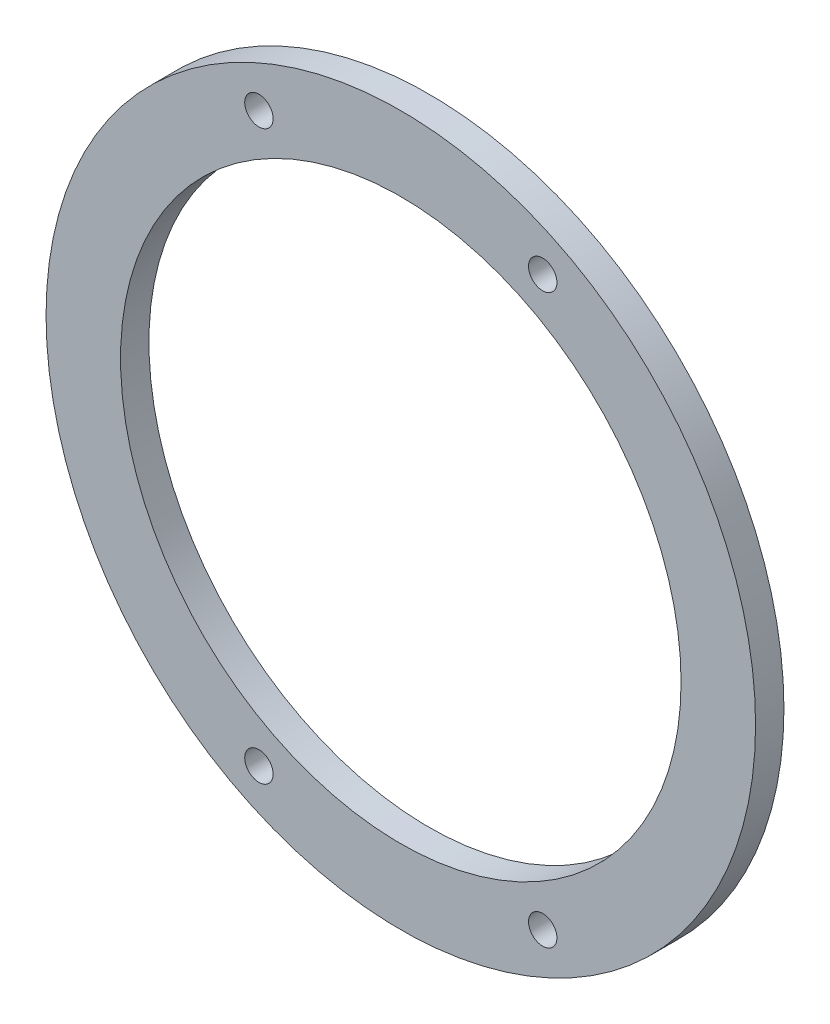
ISO-10303-21;
HEADER;
FILE_DESCRIPTION(('STEP AP214'),'2;1');
FILE_NAME('part.step','',(''),(''),'','','');
FILE_SCHEMA(('AUTOMOTIVE_DESIGN { 1 0 10303 214 1 1 1 1 }'));
ENDSEC;
DATA;
#1=APPLICATION_CONTEXT('core data for automotive mechanical design processes');
#2=APPLICATION_PROTOCOL_DEFINITION('international standard','automotive_design',2000,#1);
#3=PRODUCT_CONTEXT('',#1,'mechanical');
#4=PRODUCT('Part','Part','',(#3));
#5=PRODUCT_RELATED_PRODUCT_CATEGORY('part','',(#4));
#6=PRODUCT_DEFINITION_FORMATION('','',#4);
#7=PRODUCT_DEFINITION_CONTEXT('part definition',#1,'design');
#8=PRODUCT_DEFINITION('design','',#6,#7);
#9=PRODUCT_DEFINITION_SHAPE('','',#8);
#10=(LENGTH_UNIT() NAMED_UNIT(*) SI_UNIT(.MILLI.,.METRE.));
#11=(NAMED_UNIT(*) PLANE_ANGLE_UNIT() SI_UNIT($,.RADIAN.));
#12=(NAMED_UNIT(*) SI_UNIT($,.STERADIAN.) SOLID_ANGLE_UNIT());
#13=UNCERTAINTY_MEASURE_WITH_UNIT(LENGTH_MEASURE(1.E-05),#10,'distance_accuracy_value','');
#14=(GEOMETRIC_REPRESENTATION_CONTEXT(3) GLOBAL_UNCERTAINTY_ASSIGNED_CONTEXT((#13)) GLOBAL_UNIT_ASSIGNED_CONTEXT((#10,
#11,#12)) REPRESENTATION_CONTEXT('',''));
#15=CARTESIAN_POINT('',(0.,0.,0.));
#16=DIRECTION('',(0.,0.,1.));
#17=DIRECTION('',(1.,0.,0.));
#18=AXIS2_PLACEMENT_3D('',#15,#16,#17);
#19=CARTESIAN_POINT('',(0.,-21.8542857142857,4.));
#20=DIRECTION('',(0.,0.,1.));
#21=DIRECTION('',(1.,0.,0.));
#22=AXIS2_PLACEMENT_3D('',#19,#20,#21);
#23=PLANE('',#22);
#24=CARTESIAN_POINT('',(-19.9999999999999,-61.8542857142858,4.));
#25=DIRECTION('',(0.,0.,1.));
#26=DIRECTION('',(-1.,0.,0.));
#27=AXIS2_PLACEMENT_3D('',#24,#25,#26);
#28=CIRCLE('',#27,1.99999999999998);
#29=CARTESIAN_POINT('',(-21.9999999999999,-61.8542857142858,4.));
#30=VERTEX_POINT('',#29);
#31=EDGE_CURVE('E72',#30,#30,#28,.T.);
#32=ORIENTED_EDGE('',*,*,#31,.F.);
#33=EDGE_LOOP('',(#32));
#34=FACE_BOUND('',#33,.T.);
#35=CARTESIAN_POINT('',(20.,18.1457142857143,4.));
#36=DIRECTION('',(0.,0.,1.));
#37=DIRECTION('',(1.,0.,0.));
#38=AXIS2_PLACEMENT_3D('',#35,#36,#37);
#39=CIRCLE('',#38,2.);
#40=CARTESIAN_POINT('',(22.,18.1457142857143,4.));
#41=VERTEX_POINT('',#40);
#42=EDGE_CURVE('E56',#41,#41,#39,.T.);
#43=ORIENTED_EDGE('',*,*,#42,.F.);
#44=EDGE_LOOP('',(#43));
#45=FACE_BOUND('',#44,.T.);
#46=CARTESIAN_POINT('',(0.,-21.8542857142857,4.));
#47=DIRECTION('',(0.,0.,1.));
#48=DIRECTION('',(1.,0.,0.));
#49=AXIS2_PLACEMENT_3D('',#46,#47,#48);
#50=CIRCLE('',#49,50.);
#51=CARTESIAN_POINT('',(50.,-21.8542857142857,4.));
#52=VERTEX_POINT('',#51);
#53=EDGE_CURVE('E10',#52,#52,#50,.T.);
#54=ORIENTED_EDGE('',*,*,#53,.T.);
#55=EDGE_LOOP('',(#54));
#56=FACE_BOUND('',#55,.T.);
#57=CARTESIAN_POINT('',(-19.9999999999999,18.1457142857144,4.));
#58=DIRECTION('',(0.,0.,1.));
#59=DIRECTION('',(1.,0.,0.));
#60=AXIS2_PLACEMENT_3D('',#57,#58,#59);
#61=CIRCLE('',#60,1.99999999999998);
#62=CARTESIAN_POINT('',(-17.9999999999999,18.1457142857144,4.));
#63=VERTEX_POINT('',#62);
#64=EDGE_CURVE('E50',#63,#63,#61,.T.);
#65=ORIENTED_EDGE('',*,*,#64,.F.);
#66=EDGE_LOOP('',(#65));
#67=FACE_BOUND('',#66,.T.);
#68=CARTESIAN_POINT('',(20.,-61.8542857142857,4.));
#69=DIRECTION('',(0.,0.,1.));
#70=DIRECTION('',(-1.,0.,0.));
#71=AXIS2_PLACEMENT_3D('',#68,#69,#70);
#72=CIRCLE('',#71,2.);
#73=CARTESIAN_POINT('',(18.,-61.8542857142857,4.));
#74=VERTEX_POINT('',#73);
#75=EDGE_CURVE('E64',#74,#74,#72,.T.);
#76=ORIENTED_EDGE('',*,*,#75,.F.);
#77=EDGE_LOOP('',(#76));
#78=FACE_BOUND('',#77,.T.);
#79=CARTESIAN_POINT('',(0.,-21.8542857142857,4.));
#80=DIRECTION('',(0.,0.,1.));
#81=DIRECTION('',(1.,0.,0.));
#82=AXIS2_PLACEMENT_3D('',#79,#80,#81);
#83=CIRCLE('',#82,39.5);
#84=CARTESIAN_POINT('',(39.5,-21.8542857142857,4.));
#85=VERTEX_POINT('',#84);
#86=EDGE_CURVE('E80',#85,#85,#83,.T.);
#87=ORIENTED_EDGE('',*,*,#86,.F.);
#88=EDGE_LOOP('',(#87));
#89=FACE_BOUND('',#88,.T.);
#90=ADVANCED_FACE('F37',(#34,#45,#56,#67,#78,#89),#23,.T.);
#91=CARTESIAN_POINT('',(0.,-21.8542857142857,0.));
#92=DIRECTION('',(0.,0.,1.));
#93=DIRECTION('',(1.,0.,0.));
#94=AXIS2_PLACEMENT_3D('',#91,#92,#93);
#95=PLANE('',#94);
#96=CARTESIAN_POINT('',(0.,-21.8542857142857,0.));
#97=DIRECTION('',(0.,0.,1.));
#98=DIRECTION('',(1.,0.,0.));
#99=AXIS2_PLACEMENT_3D('',#96,#97,#98);
#100=CIRCLE('',#99,50.);
#101=CARTESIAN_POINT('',(50.,-21.8542857142857,0.));
#102=VERTEX_POINT('',#101);
#103=EDGE_CURVE('E41',#102,#102,#100,.T.);
#104=ORIENTED_EDGE('',*,*,#103,.F.);
#105=EDGE_LOOP('',(#104));
#106=FACE_BOUND('',#105,.T.);
#107=CARTESIAN_POINT('',(-19.9999999999999,18.1457142857144,0.));
#108=DIRECTION('',(0.,0.,1.));
#109=DIRECTION('',(1.,0.,0.));
#110=AXIS2_PLACEMENT_3D('',#107,#108,#109);
#111=CIRCLE('',#110,1.99999999999998);
#112=CARTESIAN_POINT('',(-17.9999999999999,18.1457142857144,0.));
#113=VERTEX_POINT('',#112);
#114=EDGE_CURVE('E52',#113,#113,#111,.T.);
#115=ORIENTED_EDGE('',*,*,#114,.T.);
#116=EDGE_LOOP('',(#115));
#117=FACE_BOUND('',#116,.T.);
#118=CARTESIAN_POINT('',(20.,18.1457142857143,0.));
#119=DIRECTION('',(0.,0.,1.));
#120=DIRECTION('',(1.,0.,0.));
#121=AXIS2_PLACEMENT_3D('',#118,#119,#120);
#122=CIRCLE('',#121,2.);
#123=CARTESIAN_POINT('',(22.,18.1457142857143,0.));
#124=VERTEX_POINT('',#123);
#125=EDGE_CURVE('E60',#124,#124,#122,.T.);
#126=ORIENTED_EDGE('',*,*,#125,.T.);
#127=EDGE_LOOP('',(#126));
#128=FACE_BOUND('',#127,.T.);
#129=CARTESIAN_POINT('',(20.,-61.8542857142857,0.));
#130=DIRECTION('',(0.,0.,1.));
#131=DIRECTION('',(-1.,0.,0.));
#132=AXIS2_PLACEMENT_3D('',#129,#130,#131);
#133=CIRCLE('',#132,2.);
#134=CARTESIAN_POINT('',(18.,-61.8542857142857,0.));
#135=VERTEX_POINT('',#134);
#136=EDGE_CURVE('E68',#135,#135,#133,.T.);
#137=ORIENTED_EDGE('',*,*,#136,.T.);
#138=EDGE_LOOP('',(#137));
#139=FACE_BOUND('',#138,.T.);
#140=CARTESIAN_POINT('',(-19.9999999999999,-61.8542857142858,0.));
#141=DIRECTION('',(0.,0.,1.));
#142=DIRECTION('',(-1.,0.,0.));
#143=AXIS2_PLACEMENT_3D('',#140,#141,#142);
#144=CIRCLE('',#143,1.99999999999998);
#145=CARTESIAN_POINT('',(-21.9999999999999,-61.8542857142858,0.));
#146=VERTEX_POINT('',#145);
#147=EDGE_CURVE('E76',#146,#146,#144,.T.);
#148=ORIENTED_EDGE('',*,*,#147,.T.);
#149=EDGE_LOOP('',(#148));
#150=FACE_BOUND('',#149,.T.);
#151=CARTESIAN_POINT('',(0.,-21.8542857142857,0.));
#152=DIRECTION('',(0.,0.,1.));
#153=DIRECTION('',(1.,0.,0.));
#154=AXIS2_PLACEMENT_3D('',#151,#152,#153);
#155=CIRCLE('',#154,39.5);
#156=CARTESIAN_POINT('',(39.5,-21.8542857142857,0.));
#157=VERTEX_POINT('',#156);
#158=EDGE_CURVE('E84',#157,#157,#155,.T.);
#159=ORIENTED_EDGE('',*,*,#158,.T.);
#160=EDGE_LOOP('',(#159));
#161=FACE_BOUND('',#160,.T.);
#162=ADVANCED_FACE('F96',(#106,#117,#128,#139,#150,#161),#95,.F.);
#163=CARTESIAN_POINT('',(0.,-21.8542857142857,4.));
#164=DIRECTION('',(0.,0.,-1.));
#165=DIRECTION('',(-1.,0.,0.));
#166=AXIS2_PLACEMENT_3D('',#163,#164,#165);
#167=CYLINDRICAL_SURFACE('',#166,50.);
#168=ORIENTED_EDGE('',*,*,#53,.F.);
#169=EDGE_LOOP('',(#168));
#170=FACE_BOUND('',#169,.T.);
#171=ORIENTED_EDGE('',*,*,#103,.T.);
#172=EDGE_LOOP('',(#171));
#173=FACE_BOUND('',#172,.T.);
#174=ADVANCED_FACE('F39',(#170,#173),#167,.T.);
#175=CARTESIAN_POINT('',(-19.9999999999999,18.1457142857144,4.));
#176=DIRECTION('',(0.,0.,-1.));
#177=DIRECTION('',(-1.,0.,0.));
#178=AXIS2_PLACEMENT_3D('',#175,#176,#177);
#179=CYLINDRICAL_SURFACE('',#178,1.99999999999998);
#180=ORIENTED_EDGE('',*,*,#64,.T.);
#181=EDGE_LOOP('',(#180));
#182=FACE_BOUND('',#181,.T.);
#183=ORIENTED_EDGE('',*,*,#114,.F.);
#184=EDGE_LOOP('',(#183));
#185=FACE_BOUND('',#184,.T.);
#186=ADVANCED_FACE('F106',(#182,#185),#179,.F.);
#187=CARTESIAN_POINT('',(20.,18.1457142857143,4.));
#188=DIRECTION('',(0.,0.,-1.));
#189=DIRECTION('',(-1.,0.,0.));
#190=AXIS2_PLACEMENT_3D('',#187,#188,#189);
#191=CYLINDRICAL_SURFACE('',#190,2.);
#192=ORIENTED_EDGE('',*,*,#42,.T.);
#193=EDGE_LOOP('',(#192));
#194=FACE_BOUND('',#193,.T.);
#195=ORIENTED_EDGE('',*,*,#125,.F.);
#196=EDGE_LOOP('',(#195));
#197=FACE_BOUND('',#196,.T.);
#198=ADVANCED_FACE('F109',(#194,#197),#191,.F.);
#199=CARTESIAN_POINT('',(20.,-61.8542857142857,4.));
#200=DIRECTION('',(0.,0.,-1.));
#201=DIRECTION('',(-1.,0.,0.));
#202=AXIS2_PLACEMENT_3D('',#199,#200,#201);
#203=CYLINDRICAL_SURFACE('',#202,2.);
#204=ORIENTED_EDGE('',*,*,#75,.T.);
#205=EDGE_LOOP('',(#204));
#206=FACE_BOUND('',#205,.T.);
#207=ORIENTED_EDGE('',*,*,#136,.F.);
#208=EDGE_LOOP('',(#207));
#209=FACE_BOUND('',#208,.T.);
#210=ADVANCED_FACE('F113',(#206,#209),#203,.F.);
#211=CARTESIAN_POINT('',(-19.9999999999999,-61.8542857142858,4.));
#212=DIRECTION('',(0.,0.,-1.));
#213=DIRECTION('',(-1.,0.,0.));
#214=AXIS2_PLACEMENT_3D('',#211,#212,#213);
#215=CYLINDRICAL_SURFACE('',#214,1.99999999999998);
#216=ORIENTED_EDGE('',*,*,#31,.T.);
#217=EDGE_LOOP('',(#216));
#218=FACE_BOUND('',#217,.T.);
#219=ORIENTED_EDGE('',*,*,#147,.F.);
#220=EDGE_LOOP('',(#219));
#221=FACE_BOUND('',#220,.T.);
#222=ADVANCED_FACE('F117',(#218,#221),#215,.F.);
#223=CARTESIAN_POINT('',(0.,-21.8542857142857,4.));
#224=DIRECTION('',(0.,0.,-1.));
#225=DIRECTION('',(-1.,0.,0.));
#226=AXIS2_PLACEMENT_3D('',#223,#224,#225);
#227=CYLINDRICAL_SURFACE('',#226,39.5);
#228=ORIENTED_EDGE('',*,*,#86,.T.);
#229=EDGE_LOOP('',(#228));
#230=FACE_BOUND('',#229,.T.);
#231=ORIENTED_EDGE('',*,*,#158,.F.);
#232=EDGE_LOOP('',(#231));
#233=FACE_BOUND('',#232,.T.);
#234=ADVANCED_FACE('F92',(#230,#233),#227,.F.);
#235=CLOSED_SHELL('',(#90,#162,#174,#186,#198,#210,#222,#234));
#236=MANIFOLD_SOLID_BREP('B2',#235);
#237=ADVANCED_BREP_SHAPE_REPRESENTATION('',(#18,#236),#14);
#238=SHAPE_DEFINITION_REPRESENTATION(#9,#237);
ENDSEC;
END-ISO-10303-21;
